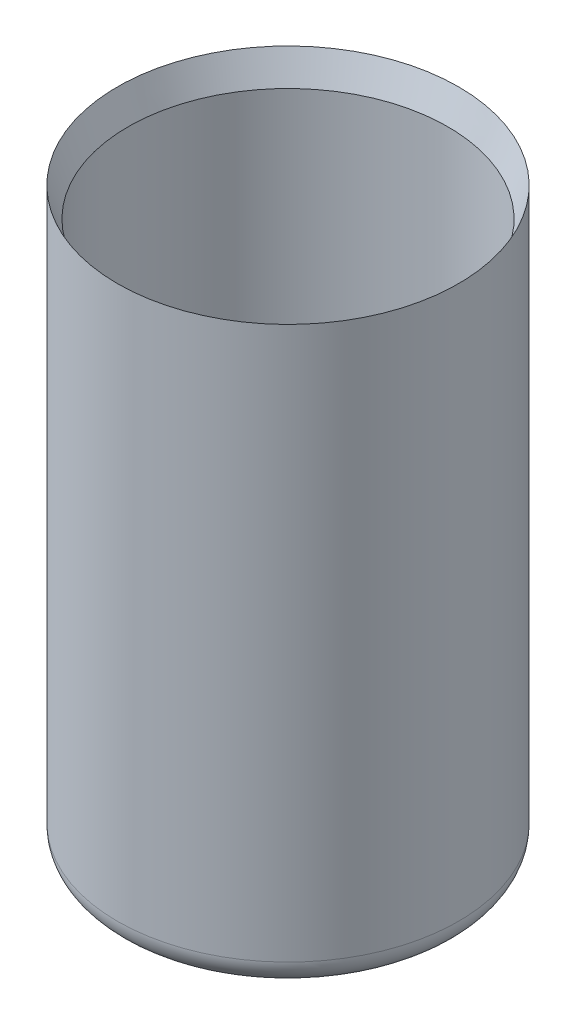
ISO-10303-21;
HEADER;
FILE_DESCRIPTION(('STEP AP214'),'2;1');
FILE_NAME('part.step','',(''),(''),'','','');
FILE_SCHEMA(('AUTOMOTIVE_DESIGN { 1 0 10303 214 1 1 1 1 }'));
ENDSEC;
DATA;
#1=APPLICATION_CONTEXT('core data for automotive mechanical design processes');
#2=APPLICATION_PROTOCOL_DEFINITION('international standard','automotive_design',2000,#1);
#3=PRODUCT_CONTEXT('',#1,'mechanical');
#4=PRODUCT('Part','Part','',(#3));
#5=PRODUCT_RELATED_PRODUCT_CATEGORY('part','',(#4));
#6=PRODUCT_DEFINITION_FORMATION('','',#4);
#7=PRODUCT_DEFINITION_CONTEXT('part definition',#1,'design');
#8=PRODUCT_DEFINITION('design','',#6,#7);
#9=PRODUCT_DEFINITION_SHAPE('','',#8);
#10=(LENGTH_UNIT() NAMED_UNIT(*) SI_UNIT(.MILLI.,.METRE.));
#11=(NAMED_UNIT(*) PLANE_ANGLE_UNIT() SI_UNIT($,.RADIAN.));
#12=(NAMED_UNIT(*) SI_UNIT($,.STERADIAN.) SOLID_ANGLE_UNIT());
#13=UNCERTAINTY_MEASURE_WITH_UNIT(LENGTH_MEASURE(1.E-05),#10,'distance_accuracy_value','');
#14=(GEOMETRIC_REPRESENTATION_CONTEXT(3) GLOBAL_UNCERTAINTY_ASSIGNED_CONTEXT((#13)) GLOBAL_UNIT_ASSIGNED_CONTEXT((#10,
#11,#12)) REPRESENTATION_CONTEXT('',''));
#15=CARTESIAN_POINT('',(0.,0.,0.));
#16=DIRECTION('',(0.,0.,1.));
#17=DIRECTION('',(1.,0.,0.));
#18=AXIS2_PLACEMENT_3D('',#15,#16,#17);
#19=CARTESIAN_POINT('',(0.,-10.,0.));
#20=DIRECTION('',(0.,1.,0.));
#21=DIRECTION('',(0.,0.,1.));
#22=AXIS2_PLACEMENT_3D('',#19,#20,#21);
#23=PLANE('',#22);
#24=CARTESIAN_POINT('',(0.,-10.,-6.));
#25=DIRECTION('',(0.,1.,0.));
#26=DIRECTION('',(0.,0.,1.));
#27=AXIS2_PLACEMENT_3D('',#24,#25,#26);
#28=CIRCLE('',#27,2.5);
#29=CARTESIAN_POINT('',(0.,-10.,-3.5));
#30=VERTEX_POINT('',#29);
#31=EDGE_CURVE('E303',#30,#30,#28,.F.);
#32=ORIENTED_EDGE('',*,*,#31,.F.);
#33=EDGE_LOOP('',(#32));
#34=FACE_BOUND('',#33,.T.);
#35=DIRECTION('',(-0.499999999999999,0.,-0.866025403784439));
#36=VECTOR('',#35,1.);
#37=CARTESIAN_POINT('',(-8.44374768689826,-10.,4.87499999999998));
#38=LINE('',#37,#36);
#39=CARTESIAN_POINT('',(0.,-10.,19.4999999999999));
#40=VERTEX_POINT('',#39);
#41=CARTESIAN_POINT('',(-16.8874953737965,-10.,-9.75));
#42=VERTEX_POINT('',#41);
#43=EDGE_CURVE('E118',#40,#42,#38,.T.);
#44=ORIENTED_EDGE('',*,*,#43,.T.);
#45=DIRECTION('',(1.,0.,0.));
#46=VECTOR('',#45,1.);
#47=CARTESIAN_POINT('',(0.,-10.,-9.74999999999999));
#48=LINE('',#47,#46);
#49=CARTESIAN_POINT('',(16.8874953737965,-10.,-9.75000000000004));
#50=VERTEX_POINT('',#49);
#51=EDGE_CURVE('E215',#42,#50,#48,.T.);
#52=ORIENTED_EDGE('',*,*,#51,.T.);
#53=DIRECTION('',(-0.5,0.,0.866025403784439));
#54=VECTOR('',#53,1.);
#55=CARTESIAN_POINT('',(8.44374768689821,-10.,4.87499999999997));
#56=LINE('',#55,#54);
#57=EDGE_CURVE('E248',#50,#40,#56,.T.);
#58=ORIENTED_EDGE('',*,*,#57,.T.);
#59=EDGE_LOOP('',(#44,#52,#58));
#60=FACE_BOUND('',#59,.T.);
#61=DIRECTION('',(0.,0.,-1.));
#62=VECTOR('',#61,1.);
#63=CARTESIAN_POINT('',(-2.5,-10.,0.));
#64=LINE('',#63,#62);
#65=CARTESIAN_POINT('',(-2.5,-10.,12.));
#66=VERTEX_POINT('',#65);
#67=CARTESIAN_POINT('',(-2.5,-10.,0.));
#68=VERTEX_POINT('',#67);
#69=EDGE_CURVE('E213',#66,#68,#64,.T.);
#70=ORIENTED_EDGE('',*,*,#69,.F.);
#71=CARTESIAN_POINT('',(0.,-10.,12.));
#72=DIRECTION('',(0.,-1.,0.));
#73=DIRECTION('',(0.,0.,-1.));
#74=AXIS2_PLACEMENT_3D('',#71,#72,#73);
#75=CIRCLE('',#74,2.5);
#76=CARTESIAN_POINT('',(2.50000000000002,-10.,12.));
#77=VERTEX_POINT('',#76);
#78=EDGE_CURVE('E209',#66,#77,#75,.F.);
#79=ORIENTED_EDGE('',*,*,#78,.T.);
#80=DIRECTION('',(0.,0.,1.));
#81=VECTOR('',#80,1.);
#82=CARTESIAN_POINT('',(2.5,-10.,0.));
#83=LINE('',#82,#81);
#84=CARTESIAN_POINT('',(2.5,-10.,0.));
#85=VERTEX_POINT('',#84);
#86=EDGE_CURVE('E110',#85,#77,#83,.T.);
#87=ORIENTED_EDGE('',*,*,#86,.F.);
#88=CARTESIAN_POINT('',(0.,-10.,0.));
#89=DIRECTION('',(0.,-1.,0.));
#90=DIRECTION('',(0.,0.,-1.));
#91=AXIS2_PLACEMENT_3D('',#88,#89,#90);
#92=CIRCLE('',#91,2.5);
#93=EDGE_CURVE('E665',#68,#85,#92,.T.);
#94=ORIENTED_EDGE('',*,*,#93,.F.);
#95=EDGE_LOOP('',(#70,#79,#87,#94));
#96=FACE_BOUND('',#95,.T.);
#97=ADVANCED_FACE('F94',(#34,#60,#96),#23,.F.);
#98=CARTESIAN_POINT('',(0.,-10.,0.));
#99=DIRECTION('',(0.,1.,0.));
#100=DIRECTION('',(0.,0.,1.));
#101=AXIS2_PLACEMENT_3D('',#98,#99,#100);
#102=CYLINDRICAL_SURFACE('',#101,32.);
#103=CARTESIAN_POINT('',(0.,98.6262612902726,0.));
#104=DIRECTION('',(0.,1.,0.));
#105=DIRECTION('',(0.,0.,1.));
#106=AXIS2_PLACEMENT_3D('',#103,#104,#105);
#107=CIRCLE('',#106,32.);
#108=CARTESIAN_POINT('',(0.,98.6262612902726,32.));
#109=VERTEX_POINT('',#108);
#110=EDGE_CURVE('E12',#109,#109,#107,.F.);
#111=ORIENTED_EDGE('',*,*,#110,.T.);
#112=EDGE_LOOP('',(#111));
#113=FACE_BOUND('',#112,.T.);
#114=CARTESIAN_POINT('',(0.,-5.,0.));
#115=DIRECTION('',(0.,1.,0.));
#116=DIRECTION('',(0.,0.,1.));
#117=AXIS2_PLACEMENT_3D('',#114,#115,#116);
#118=CIRCLE('',#117,32.);
#119=CARTESIAN_POINT('',(0.,-5.,32.));
#120=VERTEX_POINT('',#119);
#121=EDGE_CURVE('E297',#120,#120,#118,.T.);
#122=ORIENTED_EDGE('',*,*,#121,.T.);
#123=EDGE_LOOP('',(#122));
#124=FACE_BOUND('',#123,.T.);
#125=ADVANCED_FACE('F322',(#113,#124),#102,.T.);
#126=DIRECTION('',(1.,0.,0.));
#127=VECTOR('',#126,1.);
#128=CARTESIAN_POINT('',(0.,-10.,-12.25));
#129=LINE('',#128,#127);
#130=CARTESIAN_POINT('',(-16.8874953737965,-10.,-12.25));
#131=VERTEX_POINT('',#130);
#132=CARTESIAN_POINT('',(16.8874953737966,-10.,-12.2499999999999));
#133=VERTEX_POINT('',#132);
#134=EDGE_CURVE('E251',#131,#133,#129,.T.);
#135=ORIENTED_EDGE('',*,*,#134,.F.);
#136=CARTESIAN_POINT('',(-16.8874953737965,-10.,-9.74999999999999));
#137=DIRECTION('',(0.,-1.,0.));
#138=DIRECTION('',(0.,0.,-1.));
#139=AXIS2_PLACEMENT_3D('',#136,#137,#138);
#140=CIRCLE('',#139,2.49999999999998);
#141=CARTESIAN_POINT('',(-19.0525588832576,-10.,-8.49999999999999));
#142=VERTEX_POINT('',#141);
#143=EDGE_CURVE('E227',#142,#131,#140,.T.);
#144=ORIENTED_EDGE('',*,*,#143,.F.);
#145=DIRECTION('',(-0.5,0.,-0.866025403784439));
#146=VECTOR('',#145,1.);
#147=CARTESIAN_POINT('',(-10.6088111963593,-10.,6.12499999999998));
#148=LINE('',#147,#146);
#149=CARTESIAN_POINT('',(-2.16506350946106,-10.,20.75));
#150=VERTEX_POINT('',#149);
#151=EDGE_CURVE('E263',#150,#142,#148,.T.);
#152=ORIENTED_EDGE('',*,*,#151,.F.);
#153=CARTESIAN_POINT('',(0.,-10.,19.5));
#154=DIRECTION('',(0.,-1.,0.));
#155=DIRECTION('',(0.,0.,-1.));
#156=AXIS2_PLACEMENT_3D('',#153,#154,#155);
#157=CIRCLE('',#156,2.49999999999998);
#158=CARTESIAN_POINT('',(2.16506350946106,-10.,20.7499999999999));
#159=VERTEX_POINT('',#158);
#160=EDGE_CURVE('E260',#159,#150,#157,.T.);
#161=ORIENTED_EDGE('',*,*,#160,.F.);
#162=DIRECTION('',(-0.499999999999999,0.,0.86602540378444));
#163=VECTOR('',#162,1.);
#164=CARTESIAN_POINT('',(10.6088111963593,-10.,6.12499999999996));
#165=LINE('',#164,#163);
#166=CARTESIAN_POINT('',(19.0525588832576,-10.,-8.50000000000003));
#167=VERTEX_POINT('',#166);
#168=EDGE_CURVE('E257',#167,#159,#165,.T.);
#169=ORIENTED_EDGE('',*,*,#168,.F.);
#170=CARTESIAN_POINT('',(16.8874953737965,-10.,-9.74999999999999));
#171=DIRECTION('',(0.,-1.,0.));
#172=DIRECTION('',(0.,0.,-1.));
#173=AXIS2_PLACEMENT_3D('',#170,#171,#172);
#174=CIRCLE('',#173,2.49999999999994);
#175=EDGE_CURVE('E254',#133,#167,#174,.T.);
#176=ORIENTED_EDGE('',*,*,#175,.F.);
#177=EDGE_LOOP('',(#135,#144,#152,#161,#169,#176));
#178=FACE_BOUND('',#177,.T.);
#179=CARTESIAN_POINT('',(0.,-10.,0.));
#180=DIRECTION('',(0.,1.,0.));
#181=DIRECTION('',(0.,0.,1.));
#182=AXIS2_PLACEMENT_3D('',#179,#180,#181);
#183=CIRCLE('',#182,27.);
#184=CARTESIAN_POINT('',(0.,-10.,27.));
#185=VERTEX_POINT('',#184);
#186=EDGE_CURVE('E300',#185,#185,#183,.F.);
#187=ORIENTED_EDGE('',*,*,#186,.T.);
#188=EDGE_LOOP('',(#187));
#189=FACE_BOUND('',#188,.T.);
#190=ADVANCED_FACE('F325',(#178,#189),#23,.F.);
#191=CARTESIAN_POINT('',(0.,100.,0.));
#192=DIRECTION('',(0.,-1.,0.));
#193=DIRECTION('',(0.,0.,-1.));
#194=AXIS2_PLACEMENT_3D('',#191,#192,#193);
#195=CYLINDRICAL_SURFACE('',#194,30.);
#196=CARTESIAN_POINT('',(0.,93.1313064513632,0.));
#197=DIRECTION('',(0.,1.,0.));
#198=DIRECTION('',(0.,0.,1.));
#199=AXIS2_PLACEMENT_3D('',#196,#197,#198);
#200=CIRCLE('',#199,30.);
#201=CARTESIAN_POINT('',(0.,93.1313064513632,30.));
#202=VERTEX_POINT('',#201);
#203=EDGE_CURVE('E103',#202,#202,#200,.T.);
#204=ORIENTED_EDGE('',*,*,#203,.T.);
#205=EDGE_LOOP('',(#204));
#206=FACE_BOUND('',#205,.T.);
#207=CARTESIAN_POINT('',(0.,5.,0.));
#208=DIRECTION('',(0.,1.,0.));
#209=DIRECTION('',(0.,0.,1.));
#210=AXIS2_PLACEMENT_3D('',#207,#208,#209);
#211=CIRCLE('',#210,30.);
#212=CARTESIAN_POINT('',(0.,5.,30.));
#213=VERTEX_POINT('',#212);
#214=EDGE_CURVE('E287',#213,#213,#211,.F.);
#215=ORIENTED_EDGE('',*,*,#214,.T.);
#216=EDGE_LOOP('',(#215));
#217=FACE_BOUND('',#216,.T.);
#218=ADVANCED_FACE('F308',(#206,#217),#195,.F.);
#219=CARTESIAN_POINT('',(0.,0.,0.));
#220=DIRECTION('',(0.,1.,0.));
#221=DIRECTION('',(0.,0.,1.));
#222=AXIS2_PLACEMENT_3D('',#219,#220,#221);
#223=PLANE('',#222);
#224=CARTESIAN_POINT('',(0.,0.,0.));
#225=DIRECTION('',(0.,1.,0.));
#226=DIRECTION('',(0.,0.,1.));
#227=AXIS2_PLACEMENT_3D('',#224,#225,#226);
#228=CIRCLE('',#227,25.);
#229=CARTESIAN_POINT('',(0.,0.,25.));
#230=VERTEX_POINT('',#229);
#231=EDGE_CURVE('E294',#230,#230,#228,.T.);
#232=ORIENTED_EDGE('',*,*,#231,.T.);
#233=EDGE_LOOP('',(#232));
#234=FACE_BOUND('',#233,.T.);
#235=ADVANCED_FACE('F340',(#234),#223,.T.);
#236=CARTESIAN_POINT('',(0.,5.,0.));
#237=DIRECTION('',(0.,1.,0.));
#238=DIRECTION('',(0.,0.,1.));
#239=AXIS2_PLACEMENT_3D('',#236,#237,#238);
#240=TOROIDAL_SURFACE('',#239,25.,5.);
#241=ORIENTED_EDGE('',*,*,#231,.F.);
#242=EDGE_LOOP('',(#241));
#243=FACE_BOUND('',#242,.T.);
#244=ORIENTED_EDGE('',*,*,#214,.F.);
#245=EDGE_LOOP('',(#244));
#246=FACE_BOUND('',#245,.T.);
#247=ADVANCED_FACE('F348',(#243,#246),#240,.F.);
#248=CARTESIAN_POINT('',(0.,-5.,0.));
#249=DIRECTION('',(0.,1.,0.));
#250=DIRECTION('',(0.,0.,1.));
#251=AXIS2_PLACEMENT_3D('',#248,#249,#250);
#252=TOROIDAL_SURFACE('',#251,27.,5.);
#253=ORIENTED_EDGE('',*,*,#186,.F.);
#254=EDGE_LOOP('',(#253));
#255=FACE_BOUND('',#254,.T.);
#256=ORIENTED_EDGE('',*,*,#121,.F.);
#257=EDGE_LOOP('',(#256));
#258=FACE_BOUND('',#257,.T.);
#259=ADVANCED_FACE('F344',(#255,#258),#252,.T.);
#260=CARTESIAN_POINT('',(0.,-12.,-12.25));
#261=DIRECTION('',(0.,0.,1.));
#262=DIRECTION('',(1.,0.,0.));
#263=AXIS2_PLACEMENT_3D('',#260,#261,#262);
#264=PLANE('',#263);
#265=ORIENTED_EDGE('',*,*,#134,.T.);
#266=DIRECTION('',(0.,1.,0.));
#267=VECTOR('',#266,1.);
#268=CARTESIAN_POINT('',(16.8874953737966,-12.,-12.2499999999999));
#269=LINE('',#268,#267);
#270=CARTESIAN_POINT('',(16.8874953737966,-12.,-12.2499999999999));
#271=VERTEX_POINT('',#270);
#272=EDGE_CURVE('E284',#271,#133,#269,.T.);
#273=ORIENTED_EDGE('',*,*,#272,.F.);
#274=DIRECTION('',(1.,0.,0.));
#275=VECTOR('',#274,1.);
#276=CARTESIAN_POINT('',(0.,-12.,-12.25));
#277=LINE('',#276,#275);
#278=CARTESIAN_POINT('',(-16.8874953737965,-12.,-12.25));
#279=VERTEX_POINT('',#278);
#280=EDGE_CURVE('E233',#279,#271,#277,.T.);
#281=ORIENTED_EDGE('',*,*,#280,.F.);
#282=DIRECTION('',(0.,1.,0.));
#283=VECTOR('',#282,1.);
#284=CARTESIAN_POINT('',(-16.8874953737965,-12.,-12.25));
#285=LINE('',#284,#283);
#286=EDGE_CURVE('E268',#279,#131,#285,.T.);
#287=ORIENTED_EDGE('',*,*,#286,.T.);
#288=EDGE_LOOP('',(#265,#273,#281,#287));
#289=FACE_BOUND('',#288,.T.);
#290=ADVANCED_FACE('F347',(#289),#264,.F.);
#291=CARTESIAN_POINT('',(16.8874953737965,-12.,-9.74999999999999));
#292=DIRECTION('',(0.,1.,0.));
#293=DIRECTION('',(0.,0.,1.));
#294=AXIS2_PLACEMENT_3D('',#291,#292,#293);
#295=CYLINDRICAL_SURFACE('',#294,2.49999999999994);
#296=ORIENTED_EDGE('',*,*,#175,.T.);
#297=DIRECTION('',(0.,1.,0.));
#298=VECTOR('',#297,1.);
#299=CARTESIAN_POINT('',(19.0525588832576,-12.,-8.50000000000004));
#300=LINE('',#299,#298);
#301=CARTESIAN_POINT('',(19.0525588832576,-12.,-8.50000000000004));
#302=VERTEX_POINT('',#301);
#303=EDGE_CURVE('E281',#302,#167,#300,.T.);
#304=ORIENTED_EDGE('',*,*,#303,.F.);
#305=CARTESIAN_POINT('',(16.8874953737965,-12.,-9.74999999999999));
#306=DIRECTION('',(0.,-1.,0.));
#307=DIRECTION('',(0.,0.,-1.));
#308=AXIS2_PLACEMENT_3D('',#305,#306,#307);
#309=CIRCLE('',#308,2.49999999999994);
#310=EDGE_CURVE('E236',#271,#302,#309,.T.);
#311=ORIENTED_EDGE('',*,*,#310,.F.);
#312=ORIENTED_EDGE('',*,*,#272,.T.);
#313=EDGE_LOOP('',(#296,#304,#311,#312));
#314=FACE_BOUND('',#313,.T.);
#315=ADVANCED_FACE('F355',(#314),#295,.T.);
#316=CARTESIAN_POINT('',(10.6088111963593,-12.,6.12499999999996));
#317=DIRECTION('',(-0.866025403784439,0.,-0.499999999999999));
#318=DIRECTION('',(-0.499999999999999,0.,0.866025403784439));
#319=AXIS2_PLACEMENT_3D('',#316,#317,#318);
#320=PLANE('',#319);
#321=ORIENTED_EDGE('',*,*,#168,.T.);
#322=DIRECTION('',(0.,1.,0.));
#323=VECTOR('',#322,1.);
#324=CARTESIAN_POINT('',(2.1650635094611,-12.,20.75));
#325=LINE('',#324,#323);
#326=CARTESIAN_POINT('',(2.1650635094611,-12.,20.75));
#327=VERTEX_POINT('',#326);
#328=EDGE_CURVE('E278',#327,#159,#325,.T.);
#329=ORIENTED_EDGE('',*,*,#328,.F.);
#330=DIRECTION('',(-0.499999999999999,0.,0.86602540378444));
#331=VECTOR('',#330,1.);
#332=CARTESIAN_POINT('',(10.6088111963593,-12.,6.12499999999996));
#333=LINE('',#332,#331);
#334=EDGE_CURVE('E238',#302,#327,#333,.T.);
#335=ORIENTED_EDGE('',*,*,#334,.F.);
#336=ORIENTED_EDGE('',*,*,#303,.T.);
#337=EDGE_LOOP('',(#321,#329,#335,#336));
#338=FACE_BOUND('',#337,.T.);
#339=ADVANCED_FACE('F394',(#338),#320,.F.);
#340=CARTESIAN_POINT('',(0.,-12.,19.5));
#341=DIRECTION('',(0.,1.,0.));
#342=DIRECTION('',(0.,0.,1.));
#343=AXIS2_PLACEMENT_3D('',#340,#341,#342);
#344=CYLINDRICAL_SURFACE('',#343,2.49999999999998);
#345=ORIENTED_EDGE('',*,*,#160,.T.);
#346=DIRECTION('',(0.,1.,0.));
#347=VECTOR('',#346,1.);
#348=CARTESIAN_POINT('',(-2.16506350946107,-12.,20.75));
#349=LINE('',#348,#347);
#350=CARTESIAN_POINT('',(-2.16506350946107,-12.,20.75));
#351=VERTEX_POINT('',#350);
#352=EDGE_CURVE('E275',#351,#150,#349,.T.);
#353=ORIENTED_EDGE('',*,*,#352,.F.);
#354=CARTESIAN_POINT('',(0.,-12.,19.5));
#355=DIRECTION('',(0.,-1.,0.));
#356=DIRECTION('',(0.,0.,-1.));
#357=AXIS2_PLACEMENT_3D('',#354,#355,#356);
#358=CIRCLE('',#357,2.49999999999998);
#359=EDGE_CURVE('E240',#327,#351,#358,.T.);
#360=ORIENTED_EDGE('',*,*,#359,.F.);
#361=ORIENTED_EDGE('',*,*,#328,.T.);
#362=EDGE_LOOP('',(#345,#353,#360,#361));
#363=FACE_BOUND('',#362,.T.);
#364=ADVANCED_FACE('F404',(#363),#344,.T.);
#365=CARTESIAN_POINT('',(-10.6088111963593,-12.,6.12499999999998));
#366=DIRECTION('',(0.866025403784439,0.,-0.5));
#367=DIRECTION('',(-0.5,0.,-0.866025403784439));
#368=AXIS2_PLACEMENT_3D('',#365,#366,#367);
#369=PLANE('',#368);
#370=ORIENTED_EDGE('',*,*,#151,.T.);
#371=DIRECTION('',(0.,1.,0.));
#372=VECTOR('',#371,1.);
#373=CARTESIAN_POINT('',(-19.0525588832576,-12.,-8.5));
#374=LINE('',#373,#372);
#375=CARTESIAN_POINT('',(-19.0525588832576,-12.,-8.5));
#376=VERTEX_POINT('',#375);
#377=EDGE_CURVE('E271',#376,#142,#374,.T.);
#378=ORIENTED_EDGE('',*,*,#377,.F.);
#379=DIRECTION('',(-0.5,0.,-0.866025403784439));
#380=VECTOR('',#379,1.);
#381=CARTESIAN_POINT('',(-10.6088111963593,-12.,6.12499999999998));
#382=LINE('',#381,#380);
#383=EDGE_CURVE('E242',#351,#376,#382,.T.);
#384=ORIENTED_EDGE('',*,*,#383,.F.);
#385=ORIENTED_EDGE('',*,*,#352,.T.);
#386=EDGE_LOOP('',(#370,#378,#384,#385));
#387=FACE_BOUND('',#386,.T.);
#388=ADVANCED_FACE('F414',(#387),#369,.F.);
#389=CARTESIAN_POINT('',(0.,-12.,-9.74999999999999));
#390=DIRECTION('',(0.,0.,1.));
#391=DIRECTION('',(1.,0.,0.));
#392=AXIS2_PLACEMENT_3D('',#389,#390,#391);
#393=PLANE('',#392);
#394=ORIENTED_EDGE('',*,*,#51,.F.);
#395=DIRECTION('',(0.,1.,0.));
#396=VECTOR('',#395,1.);
#397=CARTESIAN_POINT('',(-16.8874953737965,-12.,-9.75));
#398=LINE('',#397,#396);
#399=CARTESIAN_POINT('',(-16.8874953737965,-12.,-9.75));
#400=VERTEX_POINT('',#399);
#401=EDGE_CURVE('E272',#400,#42,#398,.T.);
#402=ORIENTED_EDGE('',*,*,#401,.F.);
#403=DIRECTION('',(1.,0.,0.));
#404=VECTOR('',#403,1.);
#405=CARTESIAN_POINT('',(0.,-12.,-9.74999999999999));
#406=LINE('',#405,#404);
#407=CARTESIAN_POINT('',(16.8874953737965,-12.,-9.75000000000004));
#408=VERTEX_POINT('',#407);
#409=EDGE_CURVE('E223',#400,#408,#406,.T.);
#410=ORIENTED_EDGE('',*,*,#409,.T.);
#411=DIRECTION('',(0.,1.,0.));
#412=VECTOR('',#411,1.);
#413=CARTESIAN_POINT('',(16.8874953737965,-12.,-9.75000000000004));
#414=LINE('',#413,#412);
#415=EDGE_CURVE('E245',#408,#50,#414,.T.);
#416=ORIENTED_EDGE('',*,*,#415,.T.);
#417=EDGE_LOOP('',(#394,#402,#410,#416));
#418=FACE_BOUND('',#417,.T.);
#419=ADVANCED_FACE('F424',(#418),#393,.T.);
#420=CARTESIAN_POINT('',(-8.44374768689826,-12.,4.87499999999998));
#421=DIRECTION('',(0.866025403784439,0.,-0.499999999999999));
#422=DIRECTION('',(-0.499999999999999,0.,-0.866025403784439));
#423=AXIS2_PLACEMENT_3D('',#420,#421,#422);
#424=PLANE('',#423);
#425=ORIENTED_EDGE('',*,*,#43,.F.);
#426=DIRECTION('',(0.,1.,0.));
#427=VECTOR('',#426,1.);
#428=CARTESIAN_POINT('',(0.,-12.,19.4999999999999));
#429=LINE('',#428,#427);
#430=CARTESIAN_POINT('',(0.,-12.,19.4999999999999));
#431=VERTEX_POINT('',#430);
#432=EDGE_CURVE('E289',#431,#40,#429,.T.);
#433=ORIENTED_EDGE('',*,*,#432,.F.);
#434=DIRECTION('',(-0.499999999999999,0.,-0.866025403784439));
#435=VECTOR('',#434,1.);
#436=CARTESIAN_POINT('',(-8.44374768689826,-12.,4.87499999999998));
#437=LINE('',#436,#435);
#438=EDGE_CURVE('E226',#431,#400,#437,.T.);
#439=ORIENTED_EDGE('',*,*,#438,.T.);
#440=ORIENTED_EDGE('',*,*,#401,.T.);
#441=EDGE_LOOP('',(#425,#433,#439,#440));
#442=FACE_BOUND('',#441,.T.);
#443=ADVANCED_FACE('F434',(#442),#424,.T.);
#444=CARTESIAN_POINT('',(8.44374768689821,-12.,4.87499999999997));
#445=DIRECTION('',(-0.866025403784439,0.,-0.5));
#446=DIRECTION('',(-0.5,0.,0.866025403784439));
#447=AXIS2_PLACEMENT_3D('',#444,#445,#446);
#448=PLANE('',#447);
#449=ORIENTED_EDGE('',*,*,#57,.F.);
#450=ORIENTED_EDGE('',*,*,#415,.F.);
#451=DIRECTION('',(-0.5,0.,0.866025403784439));
#452=VECTOR('',#451,1.);
#453=CARTESIAN_POINT('',(8.44374768689821,-12.,4.87499999999997));
#454=LINE('',#453,#452);
#455=EDGE_CURVE('E230',#408,#431,#454,.T.);
#456=ORIENTED_EDGE('',*,*,#455,.T.);
#457=ORIENTED_EDGE('',*,*,#432,.T.);
#458=EDGE_LOOP('',(#449,#450,#456,#457));
#459=FACE_BOUND('',#458,.T.);
#460=ADVANCED_FACE('F444',(#459),#448,.T.);
#461=CARTESIAN_POINT('',(-16.8874953737965,-12.,-9.74999999999999));
#462=DIRECTION('',(0.,1.,0.));
#463=DIRECTION('',(0.,0.,1.));
#464=AXIS2_PLACEMENT_3D('',#461,#462,#463);
#465=CYLINDRICAL_SURFACE('',#464,2.49999999999998);
#466=ORIENTED_EDGE('',*,*,#143,.T.);
#467=ORIENTED_EDGE('',*,*,#286,.F.);
#468=CARTESIAN_POINT('',(-16.8874953737965,-12.,-9.74999999999999));
#469=DIRECTION('',(0.,-1.,0.));
#470=DIRECTION('',(0.,0.,-1.));
#471=AXIS2_PLACEMENT_3D('',#468,#469,#470);
#472=CIRCLE('',#471,2.49999999999998);
#473=EDGE_CURVE('E244',#376,#279,#472,.T.);
#474=ORIENTED_EDGE('',*,*,#473,.F.);
#475=ORIENTED_EDGE('',*,*,#377,.T.);
#476=EDGE_LOOP('',(#466,#467,#474,#475));
#477=FACE_BOUND('',#476,.T.);
#478=ADVANCED_FACE('F453',(#477),#465,.T.);
#479=CARTESIAN_POINT('',(0.,-12.,0.));
#480=DIRECTION('',(0.,-1.,0.));
#481=DIRECTION('',(0.,0.,-1.));
#482=AXIS2_PLACEMENT_3D('',#479,#480,#481);
#483=PLANE('',#482);
#484=ORIENTED_EDGE('',*,*,#409,.F.);
#485=ORIENTED_EDGE('',*,*,#438,.F.);
#486=ORIENTED_EDGE('',*,*,#455,.F.);
#487=EDGE_LOOP('',(#484,#485,#486));
#488=FACE_BOUND('',#487,.T.);
#489=ORIENTED_EDGE('',*,*,#280,.T.);
#490=ORIENTED_EDGE('',*,*,#310,.T.);
#491=ORIENTED_EDGE('',*,*,#334,.T.);
#492=ORIENTED_EDGE('',*,*,#359,.T.);
#493=ORIENTED_EDGE('',*,*,#383,.T.);
#494=ORIENTED_EDGE('',*,*,#473,.T.);
#495=EDGE_LOOP('',(#489,#490,#491,#492,#493,#494));
#496=FACE_BOUND('',#495,.T.);
#497=ADVANCED_FACE('F463',(#488,#496),#483,.T.);
#498=CARTESIAN_POINT('',(-2.5,-12.,0.));
#499=DIRECTION('',(1.,0.,0.));
#500=DIRECTION('',(0.,0.,-1.));
#501=AXIS2_PLACEMENT_3D('',#498,#499,#500);
#502=PLANE('',#501);
#503=ORIENTED_EDGE('',*,*,#69,.T.);
#504=DIRECTION('',(0.,1.,0.));
#505=VECTOR('',#504,1.);
#506=CARTESIAN_POINT('',(-2.5,-12.,0.));
#507=LINE('',#506,#505);
#508=CARTESIAN_POINT('',(-2.5,-12.,0.));
#509=VERTEX_POINT('',#508);
#510=EDGE_CURVE('E195',#509,#68,#507,.T.);
#511=ORIENTED_EDGE('',*,*,#510,.F.);
#512=DIRECTION('',(0.,0.,-1.));
#513=VECTOR('',#512,1.);
#514=CARTESIAN_POINT('',(-2.5,-12.,0.));
#515=LINE('',#514,#513);
#516=CARTESIAN_POINT('',(-2.5,-12.,12.));
#517=VERTEX_POINT('',#516);
#518=EDGE_CURVE('E201',#517,#509,#515,.T.);
#519=ORIENTED_EDGE('',*,*,#518,.F.);
#520=DIRECTION('',(0.,1.,0.));
#521=VECTOR('',#520,1.);
#522=CARTESIAN_POINT('',(-2.5,-12.,12.));
#523=LINE('',#522,#521);
#524=EDGE_CURVE('E669',#517,#66,#523,.T.);
#525=ORIENTED_EDGE('',*,*,#524,.T.);
#526=EDGE_LOOP('',(#503,#511,#519,#525));
#527=FACE_BOUND('',#526,.T.);
#528=ADVANCED_FACE('F211',(#527),#502,.F.);
#529=CARTESIAN_POINT('',(0.,-12.,0.));
#530=DIRECTION('',(0.,1.,0.));
#531=DIRECTION('',(0.,0.,1.));
#532=AXIS2_PLACEMENT_3D('',#529,#530,#531);
#533=CYLINDRICAL_SURFACE('',#532,2.5);
#534=ORIENTED_EDGE('',*,*,#93,.T.);
#535=DIRECTION('',(0.,1.,0.));
#536=VECTOR('',#535,1.);
#537=CARTESIAN_POINT('',(2.5,-12.,0.));
#538=LINE('',#537,#536);
#539=CARTESIAN_POINT('',(2.5,-12.,0.));
#540=VERTEX_POINT('',#539);
#541=EDGE_CURVE('E197',#540,#85,#538,.T.);
#542=ORIENTED_EDGE('',*,*,#541,.F.);
#543=CARTESIAN_POINT('',(0.,-12.,0.));
#544=DIRECTION('',(0.,-1.,0.));
#545=DIRECTION('',(0.,0.,-1.));
#546=AXIS2_PLACEMENT_3D('',#543,#544,#545);
#547=CIRCLE('',#546,2.5);
#548=EDGE_CURVE('E191',#509,#540,#547,.T.);
#549=ORIENTED_EDGE('',*,*,#548,.F.);
#550=ORIENTED_EDGE('',*,*,#510,.T.);
#551=EDGE_LOOP('',(#534,#542,#549,#550));
#552=FACE_BOUND('',#551,.T.);
#553=ADVANCED_FACE('F193',(#552),#533,.T.);
#554=CARTESIAN_POINT('',(2.5,-12.,0.));
#555=DIRECTION('',(-1.,0.,0.));
#556=DIRECTION('',(0.,0.,1.));
#557=AXIS2_PLACEMENT_3D('',#554,#555,#556);
#558=PLANE('',#557);
#559=ORIENTED_EDGE('',*,*,#86,.T.);
#560=DIRECTION('',(0.,1.,0.));
#561=VECTOR('',#560,1.);
#562=CARTESIAN_POINT('',(2.5,-12.,12.));
#563=LINE('',#562,#561);
#564=CARTESIAN_POINT('',(2.5,-12.,12.));
#565=VERTEX_POINT('',#564);
#566=EDGE_CURVE('E219',#565,#77,#563,.T.);
#567=ORIENTED_EDGE('',*,*,#566,.F.);
#568=DIRECTION('',(0.,0.,1.));
#569=VECTOR('',#568,1.);
#570=CARTESIAN_POINT('',(2.5,-12.,0.));
#571=LINE('',#570,#569);
#572=EDGE_CURVE('E200',#540,#565,#571,.T.);
#573=ORIENTED_EDGE('',*,*,#572,.F.);
#574=ORIENTED_EDGE('',*,*,#541,.T.);
#575=EDGE_LOOP('',(#559,#567,#573,#574));
#576=FACE_BOUND('',#575,.T.);
#577=ADVANCED_FACE('F490',(#576),#558,.F.);
#578=CARTESIAN_POINT('',(0.,-12.,12.));
#579=DIRECTION('',(0.,1.,0.));
#580=DIRECTION('',(0.,0.,1.));
#581=AXIS2_PLACEMENT_3D('',#578,#579,#580);
#582=CYLINDRICAL_SURFACE('',#581,2.5);
#583=ORIENTED_EDGE('',*,*,#78,.F.);
#584=ORIENTED_EDGE('',*,*,#524,.F.);
#585=CARTESIAN_POINT('',(0.,-12.,12.));
#586=DIRECTION('',(0.,-1.,0.));
#587=DIRECTION('',(0.,0.,-1.));
#588=AXIS2_PLACEMENT_3D('',#585,#586,#587);
#589=CIRCLE('',#588,2.5);
#590=EDGE_CURVE('E207',#517,#565,#589,.F.);
#591=ORIENTED_EDGE('',*,*,#590,.T.);
#592=ORIENTED_EDGE('',*,*,#566,.T.);
#593=EDGE_LOOP('',(#583,#584,#591,#592));
#594=FACE_BOUND('',#593,.T.);
#595=ADVANCED_FACE('F499',(#594),#582,.T.);
#596=CARTESIAN_POINT('',(0.,-12.,0.));
#597=DIRECTION('',(0.,-1.,0.));
#598=DIRECTION('',(0.,0.,-1.));
#599=AXIS2_PLACEMENT_3D('',#596,#597,#598);
#600=PLANE('',#599);
#601=ORIENTED_EDGE('',*,*,#518,.T.);
#602=ORIENTED_EDGE('',*,*,#548,.T.);
#603=ORIENTED_EDGE('',*,*,#572,.T.);
#604=ORIENTED_EDGE('',*,*,#590,.F.);
#605=EDGE_LOOP('',(#601,#602,#603,#604));
#606=FACE_BOUND('',#605,.T.);
#607=ADVANCED_FACE('F205',(#606),#600,.T.);
#608=CARTESIAN_POINT('',(0.,-12.,-6.));
#609=DIRECTION('',(0.,1.,0.));
#610=DIRECTION('',(0.,0.,1.));
#611=AXIS2_PLACEMENT_3D('',#608,#609,#610);
#612=CYLINDRICAL_SURFACE('',#611,2.5);
#613=CARTESIAN_POINT('',(0.,-12.,-6.));
#614=DIRECTION('',(0.,-1.,0.));
#615=DIRECTION('',(0.,0.,-1.));
#616=AXIS2_PLACEMENT_3D('',#613,#614,#615);
#617=CIRCLE('',#616,2.5);
#618=CARTESIAN_POINT('',(0.,-12.,-8.5));
#619=VERTEX_POINT('',#618);
#620=EDGE_CURVE('E663',#619,#619,#617,.T.);
#621=ORIENTED_EDGE('',*,*,#620,.F.);
#622=EDGE_LOOP('',(#621));
#623=FACE_BOUND('',#622,.T.);
#624=ORIENTED_EDGE('',*,*,#31,.T.);
#625=EDGE_LOOP('',(#624));
#626=FACE_BOUND('',#625,.T.);
#627=ADVANCED_FACE('F317',(#623,#626),#612,.T.);
#628=CARTESIAN_POINT('',(0.,-12.,0.));
#629=DIRECTION('',(0.,-1.,0.));
#630=DIRECTION('',(0.,0.,-1.));
#631=AXIS2_PLACEMENT_3D('',#628,#629,#630);
#632=PLANE('',#631);
#633=ORIENTED_EDGE('',*,*,#620,.T.);
#634=EDGE_LOOP('',(#633));
#635=FACE_BOUND('',#634,.T.);
#636=ADVANCED_FACE('F312',(#635),#632,.T.);
#637=CARTESIAN_POINT('',(0.,93.1313064513632,0.));
#638=DIRECTION('',(0.,1.,0.));
#639=DIRECTION('',(0.,0.,1.));
#640=AXIS2_PLACEMENT_3D('',#637,#638,#639);
#641=CONICAL_SURFACE('',#640,30.,0.349065850398862);
#642=ORIENTED_EDGE('',*,*,#110,.F.);
#643=EDGE_LOOP('',(#642));
#644=FACE_BOUND('',#643,.T.);
#645=ORIENTED_EDGE('',*,*,#203,.F.);
#646=EDGE_LOOP('',(#645));
#647=FACE_BOUND('',#646,.T.);
#648=ADVANCED_FACE('F97',(#644,#647),#641,.F.);
#649=CLOSED_SHELL('',(#97,#125,#190,#218,#235,#247,#259,#290,#315,#339,#364,#388,#419,#443,#460,
#478,#497,#528,#553,#577,#595,#607,#627,#636,#648));
#650=MANIFOLD_SOLID_BREP('B2',#649);
#651=ADVANCED_BREP_SHAPE_REPRESENTATION('',(#18,#650),#14);
#652=SHAPE_DEFINITION_REPRESENTATION(#9,#651);
ENDSEC;
END-ISO-10303-21;
